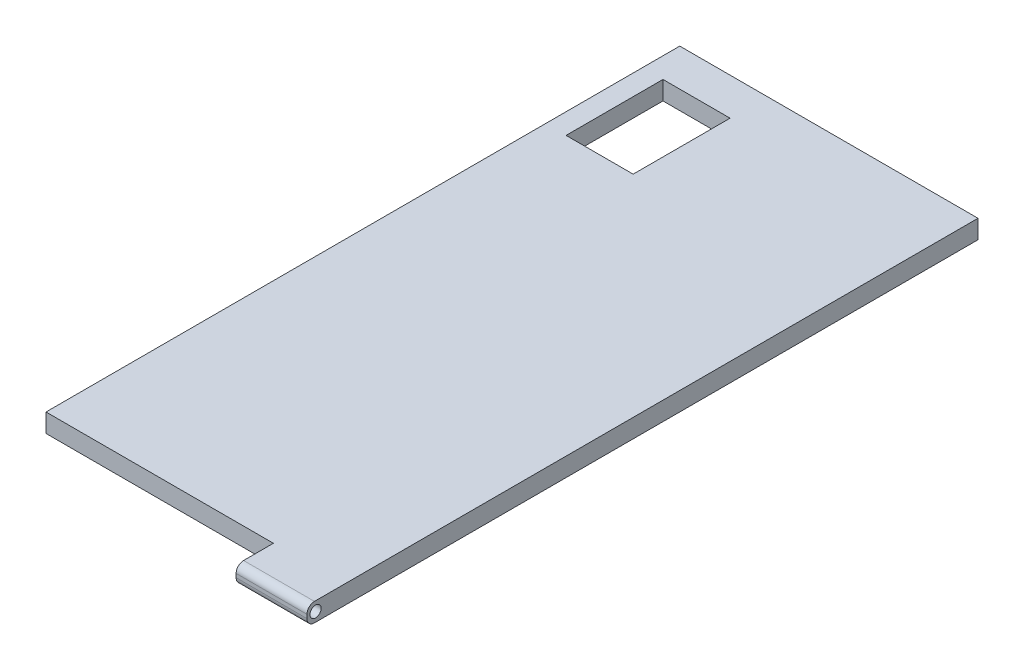
ISO-10303-21;
HEADER;
FILE_DESCRIPTION(('STEP AP214'),'2;1');
FILE_NAME('part.step','',(''),(''),'','','');
FILE_SCHEMA(('AUTOMOTIVE_DESIGN { 1 0 10303 214 1 1 1 1 }'));
ENDSEC;
DATA;
#1=APPLICATION_CONTEXT('core data for automotive mechanical design processes');
#2=APPLICATION_PROTOCOL_DEFINITION('international standard','automotive_design',2000,#1);
#3=PRODUCT_CONTEXT('',#1,'mechanical');
#4=PRODUCT('Part','Part','',(#3));
#5=PRODUCT_RELATED_PRODUCT_CATEGORY('part','',(#4));
#6=PRODUCT_DEFINITION_FORMATION('','',#4);
#7=PRODUCT_DEFINITION_CONTEXT('part definition',#1,'design');
#8=PRODUCT_DEFINITION('design','',#6,#7);
#9=PRODUCT_DEFINITION_SHAPE('','',#8);
#10=(LENGTH_UNIT() NAMED_UNIT(*) SI_UNIT(.MILLI.,.METRE.));
#11=(NAMED_UNIT(*) PLANE_ANGLE_UNIT() SI_UNIT($,.RADIAN.));
#12=(NAMED_UNIT(*) SI_UNIT($,.STERADIAN.) SOLID_ANGLE_UNIT());
#13=UNCERTAINTY_MEASURE_WITH_UNIT(LENGTH_MEASURE(1.E-05),#10,'distance_accuracy_value','');
#14=(GEOMETRIC_REPRESENTATION_CONTEXT(3) GLOBAL_UNCERTAINTY_ASSIGNED_CONTEXT((#13)) GLOBAL_UNIT_ASSIGNED_CONTEXT((#10,
#11,#12)) REPRESENTATION_CONTEXT('',''));
#15=CARTESIAN_POINT('',(0.,0.,0.));
#16=DIRECTION('',(0.,0.,1.));
#17=DIRECTION('',(1.,0.,0.));
#18=AXIS2_PLACEMENT_3D('',#15,#16,#17);
#19=CARTESIAN_POINT('',(20.,2.5,42.5));
#20=DIRECTION('',(-1.,0.,0.));
#21=DIRECTION('',(0.,0.,1.));
#22=AXIS2_PLACEMENT_3D('',#19,#20,#21);
#23=PLANE('',#22);
#24=CARTESIAN_POINT('',(20.,1.25,46.35));
#25=DIRECTION('',(-1.,0.,0.));
#26=DIRECTION('',(0.,0.,1.));
#27=AXIS2_PLACEMENT_3D('',#24,#25,#26);
#28=CIRCLE('',#27,0.749999999999999);
#29=CARTESIAN_POINT('',(20.,1.25,47.1));
#30=VERTEX_POINT('',#29);
#31=EDGE_CURVE('E341',#30,#30,#28,.T.);
#32=ORIENTED_EDGE('',*,*,#31,.T.);
#33=EDGE_LOOP('',(#32));
#34=FACE_BOUND('',#33,.T.);
#35=DIRECTION('',(0.,1.,0.));
#36=VECTOR('',#35,1.);
#37=CARTESIAN_POINT('',(20.,0.,47.5));
#38=LINE('',#37,#36);
#39=CARTESIAN_POINT('',(20.,1.,47.5));
#40=VERTEX_POINT('',#39);
#41=CARTESIAN_POINT('',(20.,1.5,47.5));
#42=VERTEX_POINT('',#41);
#43=EDGE_CURVE('E184',#40,#42,#38,.T.);
#44=ORIENTED_EDGE('',*,*,#43,.F.);
#45=CARTESIAN_POINT('',(20.,1.,46.5));
#46=DIRECTION('',(-1.,0.,0.));
#47=DIRECTION('',(0.,0.,1.));
#48=AXIS2_PLACEMENT_3D('',#45,#46,#47);
#49=CIRCLE('',#48,1.);
#50=CARTESIAN_POINT('',(20.,0.,46.5));
#51=VERTEX_POINT('',#50);
#52=EDGE_CURVE('E68',#40,#51,#49,.F.);
#53=ORIENTED_EDGE('',*,*,#52,.T.);
#54=DIRECTION('',(0.,0.,-1.));
#55=VECTOR('',#54,1.);
#56=CARTESIAN_POINT('',(20.,0.,42.5));
#57=LINE('',#56,#55);
#58=CARTESIAN_POINT('',(20.,0.,-42.5));
#59=VERTEX_POINT('',#58);
#60=EDGE_CURVE('E187',#51,#59,#57,.T.);
#61=ORIENTED_EDGE('',*,*,#60,.T.);
#62=DIRECTION('',(0.,-1.,0.));
#63=VECTOR('',#62,1.);
#64=CARTESIAN_POINT('',(20.,2.5,-42.5));
#65=LINE('',#64,#63);
#66=CARTESIAN_POINT('',(20.,2.5,-42.5));
#67=VERTEX_POINT('',#66);
#68=EDGE_CURVE('E227',#67,#59,#65,.T.);
#69=ORIENTED_EDGE('',*,*,#68,.F.);
#70=DIRECTION('',(0.,0.,-1.));
#71=VECTOR('',#70,1.);
#72=CARTESIAN_POINT('',(20.,2.5,42.5));
#73=LINE('',#72,#71);
#74=CARTESIAN_POINT('',(20.,2.5,46.5));
#75=VERTEX_POINT('',#74);
#76=EDGE_CURVE('E194',#75,#67,#73,.T.);
#77=ORIENTED_EDGE('',*,*,#76,.F.);
#78=CARTESIAN_POINT('',(20.,1.5,46.5));
#79=DIRECTION('',(-1.,0.,0.));
#80=DIRECTION('',(0.,0.,1.));
#81=AXIS2_PLACEMENT_3D('',#78,#79,#80);
#82=CIRCLE('',#81,1.);
#83=EDGE_CURVE('E246',#75,#42,#82,.F.);
#84=ORIENTED_EDGE('',*,*,#83,.T.);
#85=EDGE_LOOP('',(#44,#53,#61,#69,#77,#84));
#86=FACE_BOUND('',#85,.T.);
#87=ADVANCED_FACE('F45',(#34,#86),#23,.F.);
#88=CARTESIAN_POINT('',(-20.,2.5,-42.5));
#89=DIRECTION('',(0.,0.,1.));
#90=DIRECTION('',(1.,0.,0.));
#91=AXIS2_PLACEMENT_3D('',#88,#89,#90);
#92=PLANE('',#91);
#93=DIRECTION('',(-1.,0.,0.));
#94=VECTOR('',#93,1.);
#95=CARTESIAN_POINT('',(-20.,0.,-42.5));
#96=LINE('',#95,#94);
#97=CARTESIAN_POINT('',(-20.,0.,-42.5));
#98=VERTEX_POINT('',#97);
#99=EDGE_CURVE('E211',#59,#98,#96,.T.);
#100=ORIENTED_EDGE('',*,*,#99,.T.);
#101=DIRECTION('',(0.,-1.,0.));
#102=VECTOR('',#101,1.);
#103=CARTESIAN_POINT('',(-20.,2.5,-42.5));
#104=LINE('',#103,#102);
#105=CARTESIAN_POINT('',(-20.,2.5,-42.5));
#106=VERTEX_POINT('',#105);
#107=EDGE_CURVE('E223',#106,#98,#104,.T.);
#108=ORIENTED_EDGE('',*,*,#107,.F.);
#109=DIRECTION('',(-1.,0.,0.));
#110=VECTOR('',#109,1.);
#111=CARTESIAN_POINT('',(-20.,2.5,-42.5));
#112=LINE('',#111,#110);
#113=EDGE_CURVE('E197',#67,#106,#112,.T.);
#114=ORIENTED_EDGE('',*,*,#113,.F.);
#115=ORIENTED_EDGE('',*,*,#68,.T.);
#116=EDGE_LOOP('',(#100,#108,#114,#115));
#117=FACE_BOUND('',#116,.T.);
#118=ADVANCED_FACE('F292',(#117),#92,.F.);
#119=CARTESIAN_POINT('',(-20.,2.5,42.5));
#120=DIRECTION('',(1.,0.,0.));
#121=DIRECTION('',(0.,0.,-1.));
#122=AXIS2_PLACEMENT_3D('',#119,#120,#121);
#123=PLANE('',#122);
#124=DIRECTION('',(0.,0.,1.));
#125=VECTOR('',#124,1.);
#126=CARTESIAN_POINT('',(-20.,0.,42.5));
#127=LINE('',#126,#125);
#128=CARTESIAN_POINT('',(-20.,0.,42.5));
#129=VERTEX_POINT('',#128);
#130=EDGE_CURVE('E214',#98,#129,#127,.T.);
#131=ORIENTED_EDGE('',*,*,#130,.T.);
#132=DIRECTION('',(0.,-1.,0.));
#133=VECTOR('',#132,1.);
#134=CARTESIAN_POINT('',(-20.,2.5,42.5));
#135=LINE('',#134,#133);
#136=CARTESIAN_POINT('',(-20.,2.5,42.5));
#137=VERTEX_POINT('',#136);
#138=EDGE_CURVE('E208',#137,#129,#135,.T.);
#139=ORIENTED_EDGE('',*,*,#138,.F.);
#140=DIRECTION('',(0.,0.,1.));
#141=VECTOR('',#140,1.);
#142=CARTESIAN_POINT('',(-20.,2.5,42.5));
#143=LINE('',#142,#141);
#144=EDGE_CURVE('E201',#106,#137,#143,.T.);
#145=ORIENTED_EDGE('',*,*,#144,.F.);
#146=ORIENTED_EDGE('',*,*,#107,.T.);
#147=EDGE_LOOP('',(#131,#139,#145,#146));
#148=FACE_BOUND('',#147,.T.);
#149=ADVANCED_FACE('F288',(#148),#123,.F.);
#150=CARTESIAN_POINT('',(-20.,2.5,42.5));
#151=DIRECTION('',(0.,0.,-1.));
#152=DIRECTION('',(-1.,0.,0.));
#153=AXIS2_PLACEMENT_3D('',#150,#151,#152);
#154=PLANE('',#153);
#155=DIRECTION('',(1.,0.,0.));
#156=VECTOR('',#155,1.);
#157=CARTESIAN_POINT('',(-20.,0.,42.5));
#158=LINE('',#157,#156);
#159=CARTESIAN_POINT('',(10.5,0.,42.5));
#160=VERTEX_POINT('',#159);
#161=EDGE_CURVE('E198',#129,#160,#158,.T.);
#162=ORIENTED_EDGE('',*,*,#161,.T.);
#163=DIRECTION('',(0.,1.,0.));
#164=VECTOR('',#163,1.);
#165=CARTESIAN_POINT('',(10.5,0.,42.5));
#166=LINE('',#165,#164);
#167=CARTESIAN_POINT('',(10.5,2.5,42.5));
#168=VERTEX_POINT('',#167);
#169=EDGE_CURVE('E180',#160,#168,#166,.T.);
#170=ORIENTED_EDGE('',*,*,#169,.T.);
#171=DIRECTION('',(1.,0.,0.));
#172=VECTOR('',#171,1.);
#173=CARTESIAN_POINT('',(-20.,2.5,42.5));
#174=LINE('',#173,#172);
#175=EDGE_CURVE('E204',#137,#168,#174,.T.);
#176=ORIENTED_EDGE('',*,*,#175,.F.);
#177=ORIENTED_EDGE('',*,*,#138,.T.);
#178=EDGE_LOOP('',(#162,#170,#176,#177));
#179=FACE_BOUND('',#178,.T.);
#180=ADVANCED_FACE('F282',(#179),#154,.F.);
#181=CARTESIAN_POINT('',(0.,2.5,0.));
#182=DIRECTION('',(0.,-1.,0.));
#183=DIRECTION('',(0.,0.,-1.));
#184=AXIS2_PLACEMENT_3D('',#181,#182,#183);
#185=PLANE('',#184);
#186=DIRECTION('',(1.,0.,0.));
#187=VECTOR('',#186,1.);
#188=CARTESIAN_POINT('',(-17.25,2.5,-24.5));
#189=LINE('',#188,#187);
#190=CARTESIAN_POINT('',(-17.25,2.5,-24.5));
#191=VERTEX_POINT('',#190);
#192=CARTESIAN_POINT('',(-8.25,2.5,-24.5));
#193=VERTEX_POINT('',#192);
#194=EDGE_CURVE('E151',#191,#193,#189,.T.);
#195=ORIENTED_EDGE('',*,*,#194,.F.);
#196=DIRECTION('',(0.,0.,1.));
#197=VECTOR('',#196,1.);
#198=CARTESIAN_POINT('',(-17.25,2.5,-37.5));
#199=LINE('',#198,#197);
#200=CARTESIAN_POINT('',(-17.25,2.5,-37.5));
#201=VERTEX_POINT('',#200);
#202=EDGE_CURVE('E157',#201,#191,#199,.T.);
#203=ORIENTED_EDGE('',*,*,#202,.F.);
#204=DIRECTION('',(-1.,0.,0.));
#205=VECTOR('',#204,1.);
#206=CARTESIAN_POINT('',(-17.25,2.5,-37.5));
#207=LINE('',#206,#205);
#208=CARTESIAN_POINT('',(-8.25,2.5,-37.5));
#209=VERTEX_POINT('',#208);
#210=EDGE_CURVE('E162',#209,#201,#207,.T.);
#211=ORIENTED_EDGE('',*,*,#210,.F.);
#212=DIRECTION('',(0.,0.,-1.));
#213=VECTOR('',#212,1.);
#214=CARTESIAN_POINT('',(-8.25,2.5,-37.5));
#215=LINE('',#214,#213);
#216=EDGE_CURVE('E139',#193,#209,#215,.T.);
#217=ORIENTED_EDGE('',*,*,#216,.F.);
#218=EDGE_LOOP('',(#195,#203,#211,#217));
#219=FACE_BOUND('',#218,.T.);
#220=DIRECTION('',(0.,0.,1.));
#221=VECTOR('',#220,1.);
#222=CARTESIAN_POINT('',(10.5,2.5,42.5));
#223=LINE('',#222,#221);
#224=CARTESIAN_POINT('',(10.5,2.5,46.5));
#225=VERTEX_POINT('',#224);
#226=EDGE_CURVE('E172',#168,#225,#223,.T.);
#227=ORIENTED_EDGE('',*,*,#226,.T.);
#228=DIRECTION('',(1.,0.,0.));
#229=VECTOR('',#228,1.);
#230=CARTESIAN_POINT('',(20.,2.5,46.5));
#231=LINE('',#230,#229);
#232=EDGE_CURVE('E242',#225,#75,#231,.T.);
#233=ORIENTED_EDGE('',*,*,#232,.T.);
#234=ORIENTED_EDGE('',*,*,#76,.T.);
#235=ORIENTED_EDGE('',*,*,#113,.T.);
#236=ORIENTED_EDGE('',*,*,#144,.T.);
#237=ORIENTED_EDGE('',*,*,#175,.T.);
#238=EDGE_LOOP('',(#227,#233,#234,#235,#236,#237));
#239=FACE_BOUND('',#238,.T.);
#240=ADVANCED_FACE('F159',(#219,#239),#185,.F.);
#241=CARTESIAN_POINT('',(0.,0.,0.));
#242=DIRECTION('',(0.,-1.,0.));
#243=DIRECTION('',(0.,0.,-1.));
#244=AXIS2_PLACEMENT_3D('',#241,#242,#243);
#245=PLANE('',#244);
#246=DIRECTION('',(0.,0.,-1.));
#247=VECTOR('',#246,1.);
#248=CARTESIAN_POINT('',(-17.25,0.,0.));
#249=LINE('',#248,#247);
#250=CARTESIAN_POINT('',(-17.25,0.,-24.5));
#251=VERTEX_POINT('',#250);
#252=CARTESIAN_POINT('',(-17.25,0.,-37.5));
#253=VERTEX_POINT('',#252);
#254=EDGE_CURVE('E239',#251,#253,#249,.T.);
#255=ORIENTED_EDGE('',*,*,#254,.F.);
#256=DIRECTION('',(-1.,0.,0.));
#257=VECTOR('',#256,1.);
#258=CARTESIAN_POINT('',(0.,0.,-24.5));
#259=LINE('',#258,#257);
#260=CARTESIAN_POINT('',(-8.25,0.,-24.5));
#261=VERTEX_POINT('',#260);
#262=EDGE_CURVE('E231',#261,#251,#259,.T.);
#263=ORIENTED_EDGE('',*,*,#262,.F.);
#264=DIRECTION('',(0.,0.,1.));
#265=VECTOR('',#264,1.);
#266=CARTESIAN_POINT('',(-8.24999999999999,0.,0.));
#267=LINE('',#266,#265);
#268=CARTESIAN_POINT('',(-8.25,0.,-37.5));
#269=VERTEX_POINT('',#268);
#270=EDGE_CURVE('E142',#269,#261,#267,.T.);
#271=ORIENTED_EDGE('',*,*,#270,.F.);
#272=DIRECTION('',(1.,0.,0.));
#273=VECTOR('',#272,1.);
#274=CARTESIAN_POINT('',(0.,0.,-37.5));
#275=LINE('',#274,#273);
#276=EDGE_CURVE('E236',#253,#269,#275,.T.);
#277=ORIENTED_EDGE('',*,*,#276,.F.);
#278=EDGE_LOOP('',(#255,#263,#271,#277));
#279=FACE_BOUND('',#278,.T.);
#280=ORIENTED_EDGE('',*,*,#60,.F.);
#281=DIRECTION('',(1.,0.,0.));
#282=VECTOR('',#281,1.);
#283=CARTESIAN_POINT('',(0.,0.,46.5));
#284=LINE('',#283,#282);
#285=CARTESIAN_POINT('',(10.5,0.,46.5));
#286=VERTEX_POINT('',#285);
#287=EDGE_CURVE('E54',#51,#286,#284,.F.);
#288=ORIENTED_EDGE('',*,*,#287,.T.);
#289=DIRECTION('',(0.,0.,1.));
#290=VECTOR('',#289,1.);
#291=CARTESIAN_POINT('',(10.5,0.,42.5));
#292=LINE('',#291,#290);
#293=EDGE_CURVE('E177',#160,#286,#292,.T.);
#294=ORIENTED_EDGE('',*,*,#293,.F.);
#295=ORIENTED_EDGE('',*,*,#161,.F.);
#296=ORIENTED_EDGE('',*,*,#130,.F.);
#297=ORIENTED_EDGE('',*,*,#99,.F.);
#298=EDGE_LOOP('',(#280,#288,#294,#295,#296,#297));
#299=FACE_BOUND('',#298,.T.);
#300=ADVANCED_FACE('F284',(#279,#299),#245,.T.);
#301=CARTESIAN_POINT('',(20.,0.,47.5));
#302=DIRECTION('',(0.,0.,1.));
#303=DIRECTION('',(1.,0.,0.));
#304=AXIS2_PLACEMENT_3D('',#301,#302,#303);
#305=PLANE('',#304);
#306=DIRECTION('',(0.,1.,0.));
#307=VECTOR('',#306,1.);
#308=CARTESIAN_POINT('',(10.5,0.,47.5));
#309=LINE('',#308,#307);
#310=CARTESIAN_POINT('',(10.5,1.,47.5));
#311=VERTEX_POINT('',#310);
#312=CARTESIAN_POINT('',(10.5,1.5,47.5));
#313=VERTEX_POINT('',#312);
#314=EDGE_CURVE('E188',#311,#313,#309,.T.);
#315=ORIENTED_EDGE('',*,*,#314,.F.);
#316=DIRECTION('',(1.,0.,0.));
#317=VECTOR('',#316,1.);
#318=CARTESIAN_POINT('',(20.,1.,47.5));
#319=LINE('',#318,#317);
#320=EDGE_CURVE('E257',#311,#40,#319,.T.);
#321=ORIENTED_EDGE('',*,*,#320,.T.);
#322=ORIENTED_EDGE('',*,*,#43,.T.);
#323=DIRECTION('',(1.,0.,0.));
#324=VECTOR('',#323,1.);
#325=CARTESIAN_POINT('',(10.5,1.5,47.5));
#326=LINE('',#325,#324);
#327=EDGE_CURVE('E250',#42,#313,#326,.F.);
#328=ORIENTED_EDGE('',*,*,#327,.T.);
#329=EDGE_LOOP('',(#315,#321,#322,#328));
#330=FACE_BOUND('',#329,.T.);
#331=ADVANCED_FACE('F266',(#330),#305,.T.);
#332=CARTESIAN_POINT('',(10.5,0.,42.5));
#333=DIRECTION('',(-1.,0.,0.));
#334=DIRECTION('',(0.,0.,1.));
#335=AXIS2_PLACEMENT_3D('',#332,#333,#334);
#336=PLANE('',#335);
#337=CARTESIAN_POINT('',(10.5,1.25,46.35));
#338=DIRECTION('',(-1.,0.,0.));
#339=DIRECTION('',(0.,0.,1.));
#340=AXIS2_PLACEMENT_3D('',#337,#338,#339);
#341=CIRCLE('',#340,0.749999999999999);
#342=CARTESIAN_POINT('',(10.5,1.25,47.1));
#343=VERTEX_POINT('',#342);
#344=EDGE_CURVE('E343',#343,#343,#341,.T.);
#345=ORIENTED_EDGE('',*,*,#344,.F.);
#346=EDGE_LOOP('',(#345));
#347=FACE_BOUND('',#346,.T.);
#348=ORIENTED_EDGE('',*,*,#293,.T.);
#349=CARTESIAN_POINT('',(10.5,1.,46.5));
#350=DIRECTION('',(-1.,0.,0.));
#351=DIRECTION('',(0.,0.,1.));
#352=AXIS2_PLACEMENT_3D('',#349,#350,#351);
#353=CIRCLE('',#352,1.);
#354=EDGE_CURVE('E11',#286,#311,#353,.T.);
#355=ORIENTED_EDGE('',*,*,#354,.T.);
#356=ORIENTED_EDGE('',*,*,#314,.T.);
#357=CARTESIAN_POINT('',(10.5,1.5,46.5));
#358=DIRECTION('',(-1.,0.,0.));
#359=DIRECTION('',(0.,0.,1.));
#360=AXIS2_PLACEMENT_3D('',#357,#358,#359);
#361=CIRCLE('',#360,1.);
#362=EDGE_CURVE('E254',#313,#225,#361,.T.);
#363=ORIENTED_EDGE('',*,*,#362,.T.);
#364=ORIENTED_EDGE('',*,*,#226,.F.);
#365=ORIENTED_EDGE('',*,*,#169,.F.);
#366=EDGE_LOOP('',(#348,#355,#356,#363,#364,#365));
#367=FACE_BOUND('',#366,.T.);
#368=ADVANCED_FACE('F277',(#347,#367),#336,.T.);
#369=CARTESIAN_POINT('',(-17.25,-2.5,-37.5));
#370=DIRECTION('',(-1.,0.,0.));
#371=DIRECTION('',(0.,0.,1.));
#372=AXIS2_PLACEMENT_3D('',#369,#370,#371);
#373=PLANE('',#372);
#374=ORIENTED_EDGE('',*,*,#254,.T.);
#375=DIRECTION('',(0.,1.,0.));
#376=VECTOR('',#375,1.);
#377=CARTESIAN_POINT('',(-17.25,-2.5,-37.5));
#378=LINE('',#377,#376);
#379=EDGE_CURVE('E169',#253,#201,#378,.T.);
#380=ORIENTED_EDGE('',*,*,#379,.T.);
#381=ORIENTED_EDGE('',*,*,#202,.T.);
#382=DIRECTION('',(0.,1.,0.));
#383=VECTOR('',#382,1.);
#384=CARTESIAN_POINT('',(-17.25,-2.5,-24.5));
#385=LINE('',#384,#383);
#386=EDGE_CURVE('E147',#251,#191,#385,.T.);
#387=ORIENTED_EDGE('',*,*,#386,.F.);
#388=EDGE_LOOP('',(#374,#380,#381,#387));
#389=FACE_BOUND('',#388,.T.);
#390=ADVANCED_FACE('F322',(#389),#373,.F.);
#391=CARTESIAN_POINT('',(-17.25,-2.5,-37.5));
#392=DIRECTION('',(0.,0.,-1.));
#393=DIRECTION('',(-1.,0.,0.));
#394=AXIS2_PLACEMENT_3D('',#391,#392,#393);
#395=PLANE('',#394);
#396=ORIENTED_EDGE('',*,*,#276,.T.);
#397=DIRECTION('',(0.,1.,0.));
#398=VECTOR('',#397,1.);
#399=CARTESIAN_POINT('',(-8.25,-2.5,-37.5));
#400=LINE('',#399,#398);
#401=EDGE_CURVE('E146',#269,#209,#400,.T.);
#402=ORIENTED_EDGE('',*,*,#401,.T.);
#403=ORIENTED_EDGE('',*,*,#210,.T.);
#404=ORIENTED_EDGE('',*,*,#379,.F.);
#405=EDGE_LOOP('',(#396,#402,#403,#404));
#406=FACE_BOUND('',#405,.T.);
#407=ADVANCED_FACE('F327',(#406),#395,.F.);
#408=CARTESIAN_POINT('',(-8.25,-2.5,-37.5));
#409=DIRECTION('',(1.,0.,0.));
#410=DIRECTION('',(0.,0.,-1.));
#411=AXIS2_PLACEMENT_3D('',#408,#409,#410);
#412=PLANE('',#411);
#413=ORIENTED_EDGE('',*,*,#270,.T.);
#414=DIRECTION('',(0.,1.,0.));
#415=VECTOR('',#414,1.);
#416=CARTESIAN_POINT('',(-8.25,-2.5,-24.5));
#417=LINE('',#416,#415);
#418=EDGE_CURVE('E134',#261,#193,#417,.T.);
#419=ORIENTED_EDGE('',*,*,#418,.T.);
#420=ORIENTED_EDGE('',*,*,#216,.T.);
#421=ORIENTED_EDGE('',*,*,#401,.F.);
#422=EDGE_LOOP('',(#413,#419,#420,#421));
#423=FACE_BOUND('',#422,.T.);
#424=ADVANCED_FACE('F136',(#423),#412,.F.);
#425=CARTESIAN_POINT('',(-17.25,-2.5,-24.5));
#426=DIRECTION('',(0.,0.,1.));
#427=DIRECTION('',(1.,0.,0.));
#428=AXIS2_PLACEMENT_3D('',#425,#426,#427);
#429=PLANE('',#428);
#430=ORIENTED_EDGE('',*,*,#262,.T.);
#431=ORIENTED_EDGE('',*,*,#386,.T.);
#432=ORIENTED_EDGE('',*,*,#194,.T.);
#433=ORIENTED_EDGE('',*,*,#418,.F.);
#434=EDGE_LOOP('',(#430,#431,#432,#433));
#435=FACE_BOUND('',#434,.T.);
#436=ADVANCED_FACE('F152',(#435),#429,.F.);
#437=CARTESIAN_POINT('',(0.,1.5,46.5));
#438=DIRECTION('',(-1.,0.,0.));
#439=DIRECTION('',(0.,0.,1.));
#440=AXIS2_PLACEMENT_3D('',#437,#438,#439);
#441=CYLINDRICAL_SURFACE('',#440,1.);
#442=ORIENTED_EDGE('',*,*,#362,.F.);
#443=ORIENTED_EDGE('',*,*,#327,.F.);
#444=ORIENTED_EDGE('',*,*,#83,.F.);
#445=ORIENTED_EDGE('',*,*,#232,.F.);
#446=EDGE_LOOP('',(#442,#443,#444,#445));
#447=FACE_BOUND('',#446,.T.);
#448=ADVANCED_FACE('F275',(#447),#441,.T.);
#449=CARTESIAN_POINT('',(20.,1.,46.5));
#450=DIRECTION('',(1.,0.,0.));
#451=DIRECTION('',(0.,0.,-1.));
#452=AXIS2_PLACEMENT_3D('',#449,#450,#451);
#453=CYLINDRICAL_SURFACE('',#452,1.);
#454=ORIENTED_EDGE('',*,*,#354,.F.);
#455=ORIENTED_EDGE('',*,*,#287,.F.);
#456=ORIENTED_EDGE('',*,*,#52,.F.);
#457=ORIENTED_EDGE('',*,*,#320,.F.);
#458=EDGE_LOOP('',(#454,#455,#456,#457));
#459=FACE_BOUND('',#458,.T.);
#460=ADVANCED_FACE('F47',(#459),#453,.T.);
#461=CARTESIAN_POINT('',(20.5,1.25,46.35));
#462=DIRECTION('',(-1.,0.,0.));
#463=DIRECTION('',(0.,0.,1.));
#464=AXIS2_PLACEMENT_3D('',#461,#462,#463);
#465=CYLINDRICAL_SURFACE('',#464,0.749999999999999);
#466=ORIENTED_EDGE('',*,*,#344,.T.);
#467=EDGE_LOOP('',(#466));
#468=FACE_BOUND('',#467,.T.);
#469=ORIENTED_EDGE('',*,*,#31,.F.);
#470=EDGE_LOOP('',(#469));
#471=FACE_BOUND('',#470,.T.);
#472=ADVANCED_FACE('F294',(#468,#471),#465,.F.);
#473=CLOSED_SHELL('',(#87,#118,#149,#180,#240,#300,#331,#368,#390,#407,#424,#436,#448,#460,#472));
#474=MANIFOLD_SOLID_BREP('B2',#473);
#475=ADVANCED_BREP_SHAPE_REPRESENTATION('',(#18,#474),#14);
#476=SHAPE_DEFINITION_REPRESENTATION(#9,#475);
ENDSEC;
END-ISO-10303-21;
